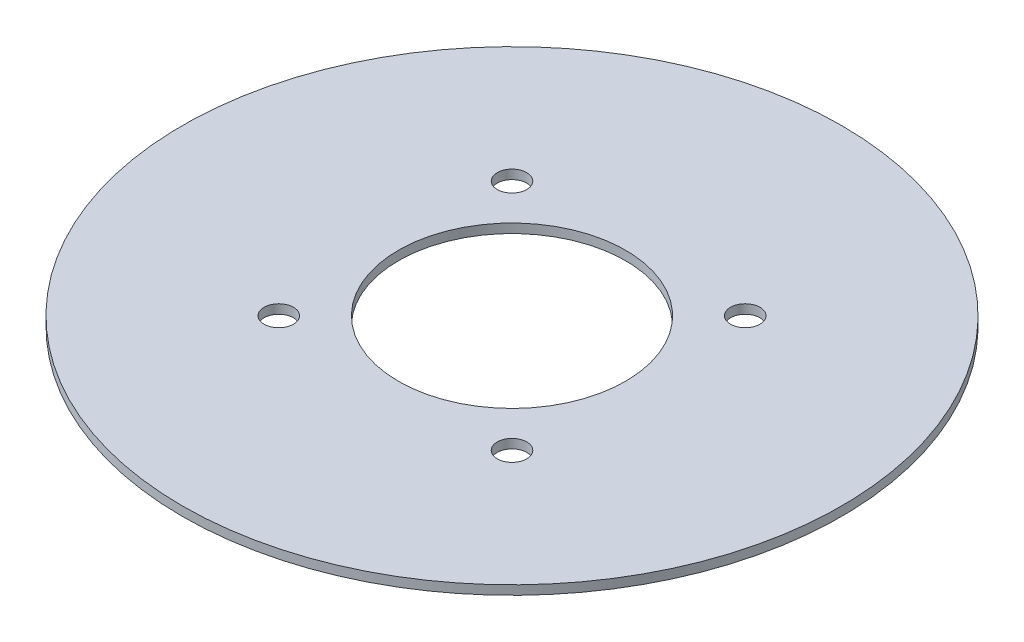
ISO-10303-21;
HEADER;
FILE_DESCRIPTION(('STEP AP214'),'2;1');
FILE_NAME('part.step','',(''),(''),'','','');
FILE_SCHEMA(('AUTOMOTIVE_DESIGN { 1 0 10303 214 1 1 1 1 }'));
ENDSEC;
DATA;
#1=APPLICATION_CONTEXT('core data for automotive mechanical design processes');
#2=APPLICATION_PROTOCOL_DEFINITION('international standard','automotive_design',2000,#1);
#3=PRODUCT_CONTEXT('',#1,'mechanical');
#4=PRODUCT('Part','Part','',(#3));
#5=PRODUCT_RELATED_PRODUCT_CATEGORY('part','',(#4));
#6=PRODUCT_DEFINITION_FORMATION('','',#4);
#7=PRODUCT_DEFINITION_CONTEXT('part definition',#1,'design');
#8=PRODUCT_DEFINITION('design','',#6,#7);
#9=PRODUCT_DEFINITION_SHAPE('','',#8);
#10=(LENGTH_UNIT() NAMED_UNIT(*) SI_UNIT(.MILLI.,.METRE.));
#11=(NAMED_UNIT(*) PLANE_ANGLE_UNIT() SI_UNIT($,.RADIAN.));
#12=(NAMED_UNIT(*) SI_UNIT($,.STERADIAN.) SOLID_ANGLE_UNIT());
#13=UNCERTAINTY_MEASURE_WITH_UNIT(LENGTH_MEASURE(1.E-05),#10,'distance_accuracy_value','');
#14=(GEOMETRIC_REPRESENTATION_CONTEXT(3) GLOBAL_UNCERTAINTY_ASSIGNED_CONTEXT((#13)) GLOBAL_UNIT_ASSIGNED_CONTEXT((#10,
#11,#12)) REPRESENTATION_CONTEXT('',''));
#15=CARTESIAN_POINT('',(0.,0.,0.));
#16=DIRECTION('',(0.,0.,1.));
#17=DIRECTION('',(1.,0.,0.));
#18=AXIS2_PLACEMENT_3D('',#15,#16,#17);
#19=CARTESIAN_POINT('',(0.,606.903613164921,0.));
#20=DIRECTION('',(0.,-1.,0.));
#21=DIRECTION('',(0.,0.,-1.));
#22=AXIS2_PLACEMENT_3D('',#19,#20,#21);
#23=CYLINDRICAL_SURFACE('',#22,32.5);
#24=CARTESIAN_POINT('',(0.,606.903613164921,0.));
#25=DIRECTION('',(0.,1.,0.));
#26=DIRECTION('',(0.,0.,1.));
#27=AXIS2_PLACEMENT_3D('',#24,#25,#26);
#28=CIRCLE('',#27,32.5);
#29=CARTESIAN_POINT('',(0.,606.903613164921,32.5));
#30=VERTEX_POINT('',#29);
#31=EDGE_CURVE('E10',#30,#30,#28,.T.);
#32=ORIENTED_EDGE('',*,*,#31,.F.);
#33=EDGE_LOOP('',(#32));
#34=FACE_BOUND('',#33,.T.);
#35=CARTESIAN_POINT('',(0.,606.003613164921,0.));
#36=DIRECTION('',(0.,1.,0.));
#37=DIRECTION('',(0.,0.,1.));
#38=AXIS2_PLACEMENT_3D('',#35,#36,#37);
#39=CIRCLE('',#38,32.5);
#40=CARTESIAN_POINT('',(0.,606.003613164921,32.5));
#41=VERTEX_POINT('',#40);
#42=EDGE_CURVE('E42',#41,#41,#39,.T.);
#43=ORIENTED_EDGE('',*,*,#42,.T.);
#44=EDGE_LOOP('',(#43));
#45=FACE_BOUND('',#44,.T.);
#46=ADVANCED_FACE('F39',(#34,#45),#23,.T.);
#47=CARTESIAN_POINT('',(0.,606.903613164921,0.));
#48=DIRECTION('',(0.,1.,0.));
#49=DIRECTION('',(0.,0.,1.));
#50=AXIS2_PLACEMENT_3D('',#47,#48,#49);
#51=PLANE('',#50);
#52=CARTESIAN_POINT('',(11.5,606.903613164921,11.5));
#53=DIRECTION('',(0.,1.,0.));
#54=DIRECTION('',(0.,0.,1.));
#55=AXIS2_PLACEMENT_3D('',#52,#53,#54);
#56=CIRCLE('',#55,1.45);
#57=CARTESIAN_POINT('',(11.5,606.903613164921,12.95));
#58=VERTEX_POINT('',#57);
#59=EDGE_CURVE('E54',#58,#58,#56,.T.);
#60=ORIENTED_EDGE('',*,*,#59,.F.);
#61=EDGE_LOOP('',(#60));
#62=FACE_BOUND('',#61,.T.);
#63=CARTESIAN_POINT('',(-11.5,606.903613164921,11.5));
#64=DIRECTION('',(0.,1.,0.));
#65=DIRECTION('',(0.,0.,1.));
#66=AXIS2_PLACEMENT_3D('',#63,#64,#65);
#67=CIRCLE('',#66,1.45);
#68=CARTESIAN_POINT('',(-11.5,606.903613164921,12.95));
#69=VERTEX_POINT('',#68);
#70=EDGE_CURVE('E60',#69,#69,#67,.T.);
#71=ORIENTED_EDGE('',*,*,#70,.F.);
#72=EDGE_LOOP('',(#71));
#73=FACE_BOUND('',#72,.T.);
#74=CARTESIAN_POINT('',(0.,606.903613164921,0.));
#75=DIRECTION('',(0.,1.,0.));
#76=DIRECTION('',(0.,0.,1.));
#77=AXIS2_PLACEMENT_3D('',#74,#75,#76);
#78=CIRCLE('',#77,11.2);
#79=CARTESIAN_POINT('',(0.,606.903613164921,11.2));
#80=VERTEX_POINT('',#79);
#81=EDGE_CURVE('E72',#80,#80,#78,.T.);
#82=ORIENTED_EDGE('',*,*,#81,.F.);
#83=EDGE_LOOP('',(#82));
#84=FACE_BOUND('',#83,.T.);
#85=CARTESIAN_POINT('',(-11.5,606.903613164921,-11.5));
#86=DIRECTION('',(0.,1.,0.));
#87=DIRECTION('',(0.,0.,1.));
#88=AXIS2_PLACEMENT_3D('',#85,#86,#87);
#89=CIRCLE('',#88,1.45);
#90=CARTESIAN_POINT('',(-11.5,606.903613164921,-10.05));
#91=VERTEX_POINT('',#90);
#92=EDGE_CURVE('E61',#91,#91,#89,.T.);
#93=ORIENTED_EDGE('',*,*,#92,.F.);
#94=EDGE_LOOP('',(#93));
#95=FACE_BOUND('',#94,.T.);
#96=CARTESIAN_POINT('',(11.5,606.903613164921,-11.5));
#97=DIRECTION('',(0.,1.,0.));
#98=DIRECTION('',(0.,0.,1.));
#99=AXIS2_PLACEMENT_3D('',#96,#97,#98);
#100=CIRCLE('',#99,1.45);
#101=CARTESIAN_POINT('',(11.5,606.903613164921,-10.05));
#102=VERTEX_POINT('',#101);
#103=EDGE_CURVE('E51',#102,#102,#100,.T.);
#104=ORIENTED_EDGE('',*,*,#103,.F.);
#105=EDGE_LOOP('',(#104));
#106=FACE_BOUND('',#105,.T.);
#107=ORIENTED_EDGE('',*,*,#31,.T.);
#108=EDGE_LOOP('',(#107));
#109=FACE_BOUND('',#108,.T.);
#110=ADVANCED_FACE('F83',(#62,#73,#84,#95,#106,#109),#51,.T.);
#111=CARTESIAN_POINT('',(0.,606.003613164921,0.));
#112=DIRECTION('',(0.,1.,0.));
#113=DIRECTION('',(0.,0.,1.));
#114=AXIS2_PLACEMENT_3D('',#111,#112,#113);
#115=PLANE('',#114);
#116=CARTESIAN_POINT('',(11.5,606.003613164921,11.5));
#117=DIRECTION('',(0.,1.,0.));
#118=DIRECTION('',(0.,0.,1.));
#119=AXIS2_PLACEMENT_3D('',#116,#117,#118);
#120=CIRCLE('',#119,1.45);
#121=CARTESIAN_POINT('',(11.5,606.003613164921,12.95));
#122=VERTEX_POINT('',#121);
#123=EDGE_CURVE('E64',#122,#122,#120,.T.);
#124=ORIENTED_EDGE('',*,*,#123,.T.);
#125=EDGE_LOOP('',(#124));
#126=FACE_BOUND('',#125,.T.);
#127=CARTESIAN_POINT('',(-11.5,606.003613164921,11.5));
#128=DIRECTION('',(0.,1.,0.));
#129=DIRECTION('',(0.,0.,1.));
#130=AXIS2_PLACEMENT_3D('',#127,#128,#129);
#131=CIRCLE('',#130,1.45);
#132=CARTESIAN_POINT('',(-11.5,606.003613164921,12.95));
#133=VERTEX_POINT('',#132);
#134=EDGE_CURVE('E57',#133,#133,#131,.T.);
#135=ORIENTED_EDGE('',*,*,#134,.T.);
#136=EDGE_LOOP('',(#135));
#137=FACE_BOUND('',#136,.T.);
#138=CARTESIAN_POINT('',(0.,606.003613164921,0.));
#139=DIRECTION('',(0.,1.,0.));
#140=DIRECTION('',(0.,0.,1.));
#141=AXIS2_PLACEMENT_3D('',#138,#139,#140);
#142=CIRCLE('',#141,11.2);
#143=CARTESIAN_POINT('',(0.,606.003613164921,11.2));
#144=VERTEX_POINT('',#143);
#145=EDGE_CURVE('E75',#144,#144,#142,.T.);
#146=ORIENTED_EDGE('',*,*,#145,.T.);
#147=EDGE_LOOP('',(#146));
#148=FACE_BOUND('',#147,.T.);
#149=CARTESIAN_POINT('',(-11.5,606.003613164921,-11.5));
#150=DIRECTION('',(0.,1.,0.));
#151=DIRECTION('',(0.,0.,1.));
#152=AXIS2_PLACEMENT_3D('',#149,#150,#151);
#153=CIRCLE('',#152,1.45);
#154=CARTESIAN_POINT('',(-11.5,606.003613164921,-10.05));
#155=VERTEX_POINT('',#154);
#156=EDGE_CURVE('E69',#155,#155,#153,.T.);
#157=ORIENTED_EDGE('',*,*,#156,.T.);
#158=EDGE_LOOP('',(#157));
#159=FACE_BOUND('',#158,.T.);
#160=CARTESIAN_POINT('',(11.5,606.003613164921,-11.5));
#161=DIRECTION('',(0.,1.,0.));
#162=DIRECTION('',(0.,0.,1.));
#163=AXIS2_PLACEMENT_3D('',#160,#161,#162);
#164=CIRCLE('',#163,1.45);
#165=CARTESIAN_POINT('',(11.5,606.003613164921,-10.05));
#166=VERTEX_POINT('',#165);
#167=EDGE_CURVE('E49',#166,#166,#164,.T.);
#168=ORIENTED_EDGE('',*,*,#167,.T.);
#169=EDGE_LOOP('',(#168));
#170=FACE_BOUND('',#169,.T.);
#171=ORIENTED_EDGE('',*,*,#42,.F.);
#172=EDGE_LOOP('',(#171));
#173=FACE_BOUND('',#172,.T.);
#174=ADVANCED_FACE('F86',(#126,#137,#148,#159,#170,#173),#115,.F.);
#175=CARTESIAN_POINT('',(11.5,606.003613164921,-11.5));
#176=DIRECTION('',(0.,1.,0.));
#177=DIRECTION('',(0.,0.,1.));
#178=AXIS2_PLACEMENT_3D('',#175,#176,#177);
#179=CYLINDRICAL_SURFACE('',#178,1.45);
#180=ORIENTED_EDGE('',*,*,#167,.F.);
#181=EDGE_LOOP('',(#180));
#182=FACE_BOUND('',#181,.T.);
#183=ORIENTED_EDGE('',*,*,#103,.T.);
#184=EDGE_LOOP('',(#183));
#185=FACE_BOUND('',#184,.T.);
#186=ADVANCED_FACE('F93',(#182,#185),#179,.F.);
#187=CARTESIAN_POINT('',(-11.5,606.003613164921,-11.5));
#188=DIRECTION('',(0.,1.,0.));
#189=DIRECTION('',(0.,0.,1.));
#190=AXIS2_PLACEMENT_3D('',#187,#188,#189);
#191=CYLINDRICAL_SURFACE('',#190,1.45);
#192=ORIENTED_EDGE('',*,*,#156,.F.);
#193=EDGE_LOOP('',(#192));
#194=FACE_BOUND('',#193,.T.);
#195=ORIENTED_EDGE('',*,*,#92,.T.);
#196=EDGE_LOOP('',(#195));
#197=FACE_BOUND('',#196,.T.);
#198=ADVANCED_FACE('F95',(#194,#197),#191,.F.);
#199=CARTESIAN_POINT('',(0.,606.003613164921,0.));
#200=DIRECTION('',(0.,1.,0.));
#201=DIRECTION('',(0.,0.,1.));
#202=AXIS2_PLACEMENT_3D('',#199,#200,#201);
#203=CYLINDRICAL_SURFACE('',#202,11.2);
#204=ORIENTED_EDGE('',*,*,#145,.F.);
#205=EDGE_LOOP('',(#204));
#206=FACE_BOUND('',#205,.T.);
#207=ORIENTED_EDGE('',*,*,#81,.T.);
#208=EDGE_LOOP('',(#207));
#209=FACE_BOUND('',#208,.T.);
#210=ADVANCED_FACE('F81',(#206,#209),#203,.F.);
#211=CARTESIAN_POINT('',(-11.5,606.003613164921,11.5));
#212=DIRECTION('',(0.,1.,0.));
#213=DIRECTION('',(0.,0.,1.));
#214=AXIS2_PLACEMENT_3D('',#211,#212,#213);
#215=CYLINDRICAL_SURFACE('',#214,1.45);
#216=ORIENTED_EDGE('',*,*,#134,.F.);
#217=EDGE_LOOP('',(#216));
#218=FACE_BOUND('',#217,.T.);
#219=ORIENTED_EDGE('',*,*,#70,.T.);
#220=EDGE_LOOP('',(#219));
#221=FACE_BOUND('',#220,.T.);
#222=ADVANCED_FACE('F144',(#218,#221),#215,.F.);
#223=CARTESIAN_POINT('',(11.5,606.003613164921,11.5));
#224=DIRECTION('',(0.,1.,0.));
#225=DIRECTION('',(0.,0.,1.));
#226=AXIS2_PLACEMENT_3D('',#223,#224,#225);
#227=CYLINDRICAL_SURFACE('',#226,1.45);
#228=ORIENTED_EDGE('',*,*,#123,.F.);
#229=EDGE_LOOP('',(#228));
#230=FACE_BOUND('',#229,.T.);
#231=ORIENTED_EDGE('',*,*,#59,.T.);
#232=EDGE_LOOP('',(#231));
#233=FACE_BOUND('',#232,.T.);
#234=ADVANCED_FACE('F154',(#230,#233),#227,.F.);
#235=CLOSED_SHELL('',(#46,#110,#174,#186,#198,#210,#222,#234));
#236=MANIFOLD_SOLID_BREP('B2',#235);
#237=ADVANCED_BREP_SHAPE_REPRESENTATION('',(#18,#236),#14);
#238=SHAPE_DEFINITION_REPRESENTATION(#9,#237);
ENDSEC;
END-ISO-10303-21;
